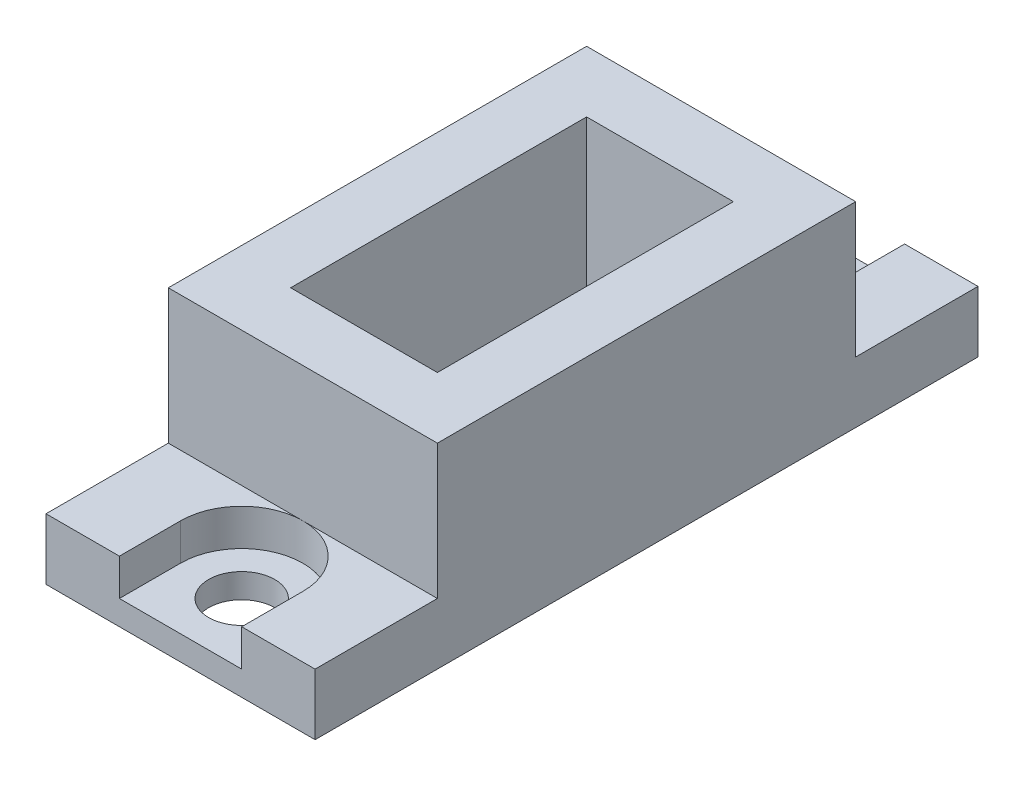
ISO-10303-21;
HEADER;
FILE_DESCRIPTION(('STEP AP214'),'2;1');
FILE_NAME('part.step','',(''),(''),'','','');
FILE_SCHEMA(('AUTOMOTIVE_DESIGN { 1 0 10303 214 1 1 1 1 }'));
ENDSEC;
DATA;
#1=APPLICATION_CONTEXT('core data for automotive mechanical design processes');
#2=APPLICATION_PROTOCOL_DEFINITION('international standard','automotive_design',2000,#1);
#3=PRODUCT_CONTEXT('',#1,'mechanical');
#4=PRODUCT('Part','Part','',(#3));
#5=PRODUCT_RELATED_PRODUCT_CATEGORY('part','',(#4));
#6=PRODUCT_DEFINITION_FORMATION('','',#4);
#7=PRODUCT_DEFINITION_CONTEXT('part definition',#1,'design');
#8=PRODUCT_DEFINITION('design','',#6,#7);
#9=PRODUCT_DEFINITION_SHAPE('','',#8);
#10=(LENGTH_UNIT() NAMED_UNIT(*) SI_UNIT(.MILLI.,.METRE.));
#11=(NAMED_UNIT(*) PLANE_ANGLE_UNIT() SI_UNIT($,.RADIAN.));
#12=(NAMED_UNIT(*) SI_UNIT($,.STERADIAN.) SOLID_ANGLE_UNIT());
#13=UNCERTAINTY_MEASURE_WITH_UNIT(LENGTH_MEASURE(1.E-05),#10,'distance_accuracy_value','');
#14=(GEOMETRIC_REPRESENTATION_CONTEXT(3) GLOBAL_UNCERTAINTY_ASSIGNED_CONTEXT((#13)) GLOBAL_UNIT_ASSIGNED_CONTEXT((#10,
#11,#12)) REPRESENTATION_CONTEXT('',''));
#15=CARTESIAN_POINT('',(0.,0.,0.));
#16=DIRECTION('',(0.,0.,1.));
#17=DIRECTION('',(1.,0.,0.));
#18=AXIS2_PLACEMENT_3D('',#15,#16,#17);
#19=CARTESIAN_POINT('',(0.,5.,0.));
#20=DIRECTION('',(0.,1.,0.));
#21=DIRECTION('',(0.,0.,1.));
#22=AXIS2_PLACEMENT_3D('',#19,#20,#21);
#23=PLANE('',#22);
#24=DIRECTION('',(0.,0.,1.));
#25=VECTOR('',#24,1.);
#26=CARTESIAN_POINT('',(1.,5.,-36.2519189633827));
#27=LINE('',#26,#25);
#28=CARTESIAN_POINT('',(1.,5.,-41.2519189633827));
#29=VERTEX_POINT('',#28);
#30=CARTESIAN_POINT('',(1.,5.,-36.2519189633827));
#31=VERTEX_POINT('',#30);
#32=EDGE_CURVE('E51',#29,#31,#27,.T.);
#33=ORIENTED_EDGE('',*,*,#32,.F.);
#34=DIRECTION('',(-1.,0.,0.));
#35=VECTOR('',#34,1.);
#36=CARTESIAN_POINT('',(17.,5.,-41.2519189633827));
#37=LINE('',#36,#35);
#38=CARTESIAN_POINT('',(-5.,5.,-41.2519189633827));
#39=VERTEX_POINT('',#38);
#40=EDGE_CURVE('E271',#29,#39,#37,.T.);
#41=ORIENTED_EDGE('',*,*,#40,.T.);
#42=DIRECTION('',(0.,0.,1.));
#43=VECTOR('',#42,1.);
#44=CARTESIAN_POINT('',(-5.,5.,-31.2519189633827));
#45=LINE('',#44,#43);
#46=CARTESIAN_POINT('',(-5.,5.,-31.2519189633827));
#47=VERTEX_POINT('',#46);
#48=EDGE_CURVE('E275',#39,#47,#45,.T.);
#49=ORIENTED_EDGE('',*,*,#48,.T.);
#50=DIRECTION('',(1.,0.,0.));
#51=VECTOR('',#50,1.);
#52=CARTESIAN_POINT('',(-5.,5.,-31.2519189633827));
#53=LINE('',#52,#51);
#54=CARTESIAN_POINT('',(6.,5.,-31.2519189633827));
#55=VERTEX_POINT('',#54);
#56=EDGE_CURVE('E265',#47,#55,#53,.T.);
#57=ORIENTED_EDGE('',*,*,#56,.T.);
#58=CARTESIAN_POINT('',(6.,5.,-36.2519189633827));
#59=DIRECTION('',(0.,1.,0.));
#60=DIRECTION('',(0.,0.,1.));
#61=AXIS2_PLACEMENT_3D('',#58,#59,#60);
#62=CIRCLE('',#61,5.);
#63=EDGE_CURVE('E205',#31,#55,#62,.T.);
#64=ORIENTED_EDGE('',*,*,#63,.F.);
#65=EDGE_LOOP('',(#33,#41,#49,#57,#64));
#66=FACE_BOUND('',#65,.T.);
#67=ADVANCED_FACE('F34',(#66),#23,.T.);
#68=CARTESIAN_POINT('',(0.,5.,0.));
#69=DIRECTION('',(0.,-1.,0.));
#70=DIRECTION('',(0.,0.,-1.));
#71=AXIS2_PLACEMENT_3D('',#68,#69,#70);
#72=PLANE('',#71);
#73=CARTESIAN_POINT('',(6.,5.,7.94808103661732));
#74=DIRECTION('',(0.,1.,0.));
#75=DIRECTION('',(0.,0.,-1.));
#76=AXIS2_PLACEMENT_3D('',#73,#74,#75);
#77=CIRCLE('',#76,5.);
#78=CARTESIAN_POINT('',(11.,5.,7.94808103661732));
#79=VERTEX_POINT('',#78);
#80=CARTESIAN_POINT('',(6.,5.,2.94808103661732));
#81=VERTEX_POINT('',#80);
#82=EDGE_CURVE('E221',#79,#81,#77,.T.);
#83=ORIENTED_EDGE('',*,*,#82,.F.);
#84=DIRECTION('',(0.,0.,-1.));
#85=VECTOR('',#84,1.);
#86=CARTESIAN_POINT('',(11.,5.,12.9480810366173));
#87=LINE('',#86,#85);
#88=CARTESIAN_POINT('',(11.,5.,12.9480810366173));
#89=VERTEX_POINT('',#88);
#90=EDGE_CURVE('E232',#89,#79,#87,.T.);
#91=ORIENTED_EDGE('',*,*,#90,.F.);
#92=DIRECTION('',(1.,0.,0.));
#93=VECTOR('',#92,1.);
#94=CARTESIAN_POINT('',(17.,5.,12.9480810366173));
#95=LINE('',#94,#93);
#96=CARTESIAN_POINT('',(17.,5.,12.9480810366173));
#97=VERTEX_POINT('',#96);
#98=EDGE_CURVE('E249',#89,#97,#95,.T.);
#99=ORIENTED_EDGE('',*,*,#98,.T.);
#100=DIRECTION('',(0.,0.,-1.));
#101=VECTOR('',#100,1.);
#102=CARTESIAN_POINT('',(17.,5.,2.94808103661732));
#103=LINE('',#102,#101);
#104=CARTESIAN_POINT('',(17.,5.,2.94808103661732));
#105=VERTEX_POINT('',#104);
#106=EDGE_CURVE('E253',#97,#105,#103,.T.);
#107=ORIENTED_EDGE('',*,*,#106,.T.);
#108=DIRECTION('',(-1.,0.,0.));
#109=VECTOR('',#108,1.);
#110=CARTESIAN_POINT('',(-5.,5.,2.94808103661732));
#111=LINE('',#110,#109);
#112=EDGE_CURVE('E243',#105,#81,#111,.T.);
#113=ORIENTED_EDGE('',*,*,#112,.T.);
#114=EDGE_LOOP('',(#83,#91,#99,#107,#113));
#115=FACE_BOUND('',#114,.T.);
#116=ADVANCED_FACE('F397',(#115),#72,.F.);
#117=CARTESIAN_POINT('',(-5.,16.,2.94808103661732));
#118=DIRECTION('',(0.,0.,-1.));
#119=DIRECTION('',(-1.,0.,0.));
#120=AXIS2_PLACEMENT_3D('',#117,#118,#119);
#121=PLANE('',#120);
#122=ORIENTED_EDGE('',*,*,#112,.F.);
#123=DIRECTION('',(0.,-1.,0.));
#124=VECTOR('',#123,1.);
#125=CARTESIAN_POINT('',(17.,16.,2.94808103661732));
#126=LINE('',#125,#124);
#127=CARTESIAN_POINT('',(17.,16.,2.94808103661732));
#128=VERTEX_POINT('',#127);
#129=EDGE_CURVE('E336',#128,#105,#126,.T.);
#130=ORIENTED_EDGE('',*,*,#129,.F.);
#131=DIRECTION('',(1.,0.,0.));
#132=VECTOR('',#131,1.);
#133=CARTESIAN_POINT('',(-5.,16.,2.94808103661732));
#134=LINE('',#133,#132);
#135=CARTESIAN_POINT('',(-5.,16.,2.94808103661732));
#136=VERTEX_POINT('',#135);
#137=EDGE_CURVE('E321',#136,#128,#134,.T.);
#138=ORIENTED_EDGE('',*,*,#137,.F.);
#139=DIRECTION('',(0.,-1.,0.));
#140=VECTOR('',#139,1.);
#141=CARTESIAN_POINT('',(-5.,16.,2.94808103661732));
#142=LINE('',#141,#140);
#143=CARTESIAN_POINT('',(-5.,5.,2.94808103661732));
#144=VERTEX_POINT('',#143);
#145=EDGE_CURVE('E339',#136,#144,#142,.T.);
#146=ORIENTED_EDGE('',*,*,#145,.T.);
#147=EDGE_CURVE('E247',#81,#144,#111,.T.);
#148=ORIENTED_EDGE('',*,*,#147,.F.);
#149=EDGE_LOOP('',(#122,#130,#138,#146,#148));
#150=FACE_BOUND('',#149,.T.);
#151=ADVANCED_FACE('F405',(#150),#121,.F.);
#152=CARTESIAN_POINT('',(-5.,16.,-31.2519189633827));
#153=DIRECTION('',(0.,0.,1.));
#154=DIRECTION('',(1.,0.,0.));
#155=AXIS2_PLACEMENT_3D('',#152,#153,#154);
#156=PLANE('',#155);
#157=ORIENTED_EDGE('',*,*,#56,.F.);
#158=DIRECTION('',(0.,-1.,0.));
#159=VECTOR('',#158,1.);
#160=CARTESIAN_POINT('',(-5.,16.,-31.2519189633827));
#161=LINE('',#160,#159);
#162=CARTESIAN_POINT('',(-5.,16.,-31.2519189633827));
#163=VERTEX_POINT('',#162);
#164=EDGE_CURVE('E328',#163,#47,#161,.T.);
#165=ORIENTED_EDGE('',*,*,#164,.F.);
#166=DIRECTION('',(-1.,0.,0.));
#167=VECTOR('',#166,1.);
#168=CARTESIAN_POINT('',(-5.,16.,-31.2519189633827));
#169=LINE('',#168,#167);
#170=CARTESIAN_POINT('',(17.,16.,-31.2519189633827));
#171=VERTEX_POINT('',#170);
#172=EDGE_CURVE('E326',#171,#163,#169,.T.);
#173=ORIENTED_EDGE('',*,*,#172,.F.);
#174=DIRECTION('',(0.,-1.,0.));
#175=VECTOR('',#174,1.);
#176=CARTESIAN_POINT('',(17.,16.,-31.2519189633827));
#177=LINE('',#176,#175);
#178=CARTESIAN_POINT('',(17.,5.,-31.2519189633827));
#179=VERTEX_POINT('',#178);
#180=EDGE_CURVE('E333',#171,#179,#177,.T.);
#181=ORIENTED_EDGE('',*,*,#180,.T.);
#182=EDGE_CURVE('E269',#55,#179,#53,.T.);
#183=ORIENTED_EDGE('',*,*,#182,.F.);
#184=EDGE_LOOP('',(#157,#165,#173,#181,#183));
#185=FACE_BOUND('',#184,.T.);
#186=ADVANCED_FACE('F429',(#185),#156,.F.);
#187=CARTESIAN_POINT('',(0.,16.,0.));
#188=DIRECTION('',(0.,1.,0.));
#189=DIRECTION('',(0.,0.,1.));
#190=AXIS2_PLACEMENT_3D('',#187,#188,#189);
#191=PLANE('',#190);
#192=DIRECTION('',(0.,0.,1.));
#193=VECTOR('',#192,1.);
#194=CARTESIAN_POINT('',(-5.,16.,-31.2519189633827));
#195=LINE('',#194,#193);
#196=EDGE_CURVE('E318',#163,#136,#195,.T.);
#197=ORIENTED_EDGE('',*,*,#196,.T.);
#198=ORIENTED_EDGE('',*,*,#137,.T.);
#199=DIRECTION('',(0.,0.,-1.));
#200=VECTOR('',#199,1.);
#201=CARTESIAN_POINT('',(17.,16.,-31.2519189633827));
#202=LINE('',#201,#200);
#203=EDGE_CURVE('E324',#128,#171,#202,.T.);
#204=ORIENTED_EDGE('',*,*,#203,.T.);
#205=ORIENTED_EDGE('',*,*,#172,.T.);
#206=EDGE_LOOP('',(#197,#198,#204,#205));
#207=FACE_BOUND('',#206,.T.);
#208=DIRECTION('',(0.,0.,-1.));
#209=VECTOR('',#208,1.);
#210=CARTESIAN_POINT('',(12.,16.,-26.2519189633827));
#211=LINE('',#210,#209);
#212=CARTESIAN_POINT('',(12.,16.,-2.05191896338268));
#213=VERTEX_POINT('',#212);
#214=CARTESIAN_POINT('',(12.,16.,-26.2519189633827));
#215=VERTEX_POINT('',#214);
#216=EDGE_CURVE('E289',#213,#215,#211,.T.);
#217=ORIENTED_EDGE('',*,*,#216,.F.);
#218=DIRECTION('',(1.,0.,0.));
#219=VECTOR('',#218,1.);
#220=CARTESIAN_POINT('',(12.,16.,-2.05191896338268));
#221=LINE('',#220,#219);
#222=CARTESIAN_POINT('',(0.,16.,-2.05191896338268));
#223=VERTEX_POINT('',#222);
#224=EDGE_CURVE('E287',#223,#213,#221,.T.);
#225=ORIENTED_EDGE('',*,*,#224,.F.);
#226=DIRECTION('',(0.,0.,1.));
#227=VECTOR('',#226,1.);
#228=CARTESIAN_POINT('',(0.,16.,-2.05191896338268));
#229=LINE('',#228,#227);
#230=CARTESIAN_POINT('',(0.,16.,-26.2519189633827));
#231=VERTEX_POINT('',#230);
#232=EDGE_CURVE('E295',#231,#223,#229,.T.);
#233=ORIENTED_EDGE('',*,*,#232,.F.);
#234=DIRECTION('',(-1.,0.,0.));
#235=VECTOR('',#234,1.);
#236=CARTESIAN_POINT('',(0.,16.,-26.2519189633827));
#237=LINE('',#236,#235);
#238=EDGE_CURVE('E292',#215,#231,#237,.T.);
#239=ORIENTED_EDGE('',*,*,#238,.F.);
#240=EDGE_LOOP('',(#217,#225,#233,#239));
#241=FACE_BOUND('',#240,.T.);
#242=ADVANCED_FACE('F363',(#207,#241),#191,.T.);
#243=CARTESIAN_POINT('',(0.,0.,0.));
#244=DIRECTION('',(0.,1.,0.));
#245=DIRECTION('',(0.,0.,1.));
#246=AXIS2_PLACEMENT_3D('',#243,#244,#245);
#247=PLANE('',#246);
#248=CARTESIAN_POINT('',(6.,0.,7.94808103661732));
#249=DIRECTION('',(0.,-1.,0.));
#250=DIRECTION('',(0.,0.,-1.));
#251=AXIS2_PLACEMENT_3D('',#248,#249,#250);
#252=CIRCLE('',#251,2.7);
#253=CARTESIAN_POINT('',(6.,0.,5.24808103661732));
#254=VERTEX_POINT('',#253);
#255=EDGE_CURVE('E345',#254,#254,#252,.T.);
#256=ORIENTED_EDGE('',*,*,#255,.F.);
#257=EDGE_LOOP('',(#256));
#258=FACE_BOUND('',#257,.T.);
#259=CARTESIAN_POINT('',(6.,0.,-36.2519189633827));
#260=DIRECTION('',(0.,-1.,0.));
#261=DIRECTION('',(0.,0.,-1.));
#262=AXIS2_PLACEMENT_3D('',#259,#260,#261);
#263=CIRCLE('',#262,2.7);
#264=CARTESIAN_POINT('',(6.,0.,-38.9519189633827));
#265=VERTEX_POINT('',#264);
#266=EDGE_CURVE('E350',#265,#265,#263,.T.);
#267=ORIENTED_EDGE('',*,*,#266,.F.);
#268=EDGE_LOOP('',(#267));
#269=FACE_BOUND('',#268,.T.);
#270=DIRECTION('',(0.,0.,1.));
#271=VECTOR('',#270,1.);
#272=CARTESIAN_POINT('',(-5.,0.,-31.2519189633827));
#273=LINE('',#272,#271);
#274=CARTESIAN_POINT('',(-5.,0.,-41.2519189633827));
#275=VERTEX_POINT('',#274);
#276=CARTESIAN_POINT('',(-5.,0.,12.9480810366173));
#277=VERTEX_POINT('',#276);
#278=EDGE_CURVE('E317',#275,#277,#273,.T.);
#279=ORIENTED_EDGE('',*,*,#278,.F.);
#280=DIRECTION('',(-1.,0.,0.));
#281=VECTOR('',#280,1.);
#282=CARTESIAN_POINT('',(17.,0.,-41.2519189633827));
#283=LINE('',#282,#281);
#284=CARTESIAN_POINT('',(17.,0.,-41.2519189633827));
#285=VERTEX_POINT('',#284);
#286=EDGE_CURVE('E264',#285,#275,#283,.T.);
#287=ORIENTED_EDGE('',*,*,#286,.F.);
#288=DIRECTION('',(0.,0.,-1.));
#289=VECTOR('',#288,1.);
#290=CARTESIAN_POINT('',(17.,0.,-31.2519189633827));
#291=LINE('',#290,#289);
#292=CARTESIAN_POINT('',(17.,0.,12.9480810366173));
#293=VERTEX_POINT('',#292);
#294=EDGE_CURVE('E322',#293,#285,#291,.T.);
#295=ORIENTED_EDGE('',*,*,#294,.F.);
#296=DIRECTION('',(1.,0.,0.));
#297=VECTOR('',#296,1.);
#298=CARTESIAN_POINT('',(17.,0.,12.9480810366173));
#299=LINE('',#298,#297);
#300=EDGE_CURVE('E213',#277,#293,#299,.T.);
#301=ORIENTED_EDGE('',*,*,#300,.F.);
#302=EDGE_LOOP('',(#279,#287,#295,#301));
#303=FACE_BOUND('',#302,.T.);
#304=DIRECTION('',(1.,0.,0.));
#305=VECTOR('',#304,1.);
#306=CARTESIAN_POINT('',(12.,0.,-2.05191896338268));
#307=LINE('',#306,#305);
#308=CARTESIAN_POINT('',(0.,0.,-2.05191896338268));
#309=VERTEX_POINT('',#308);
#310=CARTESIAN_POINT('',(12.,0.,-2.05191896338268));
#311=VERTEX_POINT('',#310);
#312=EDGE_CURVE('E286',#309,#311,#307,.T.);
#313=ORIENTED_EDGE('',*,*,#312,.T.);
#314=DIRECTION('',(0.,0.,-1.));
#315=VECTOR('',#314,1.);
#316=CARTESIAN_POINT('',(12.,0.,-26.2519189633827));
#317=LINE('',#316,#315);
#318=CARTESIAN_POINT('',(12.,0.,-26.2519189633827));
#319=VERTEX_POINT('',#318);
#320=EDGE_CURVE('E300',#311,#319,#317,.T.);
#321=ORIENTED_EDGE('',*,*,#320,.T.);
#322=DIRECTION('',(-1.,0.,0.));
#323=VECTOR('',#322,1.);
#324=CARTESIAN_POINT('',(0.,0.,-26.2519189633827));
#325=LINE('',#324,#323);
#326=CARTESIAN_POINT('',(0.,0.,-26.2519189633827));
#327=VERTEX_POINT('',#326);
#328=EDGE_CURVE('E303',#319,#327,#325,.T.);
#329=ORIENTED_EDGE('',*,*,#328,.T.);
#330=DIRECTION('',(0.,0.,1.));
#331=VECTOR('',#330,1.);
#332=CARTESIAN_POINT('',(0.,0.,-2.05191896338268));
#333=LINE('',#332,#331);
#334=EDGE_CURVE('E290',#327,#309,#333,.T.);
#335=ORIENTED_EDGE('',*,*,#334,.T.);
#336=EDGE_LOOP('',(#313,#321,#329,#335));
#337=FACE_BOUND('',#336,.T.);
#338=ADVANCED_FACE('F360',(#258,#269,#303,#337),#247,.F.);
#339=CARTESIAN_POINT('',(-5.,16.,-31.2519189633827));
#340=DIRECTION('',(1.,0.,0.));
#341=DIRECTION('',(0.,0.,-1.));
#342=AXIS2_PLACEMENT_3D('',#339,#340,#341);
#343=PLANE('',#342);
#344=ORIENTED_EDGE('',*,*,#278,.T.);
#345=DIRECTION('',(0.,-1.,0.));
#346=VECTOR('',#345,1.);
#347=CARTESIAN_POINT('',(-5.,5.,12.9480810366173));
#348=LINE('',#347,#346);
#349=CARTESIAN_POINT('',(-5.,5.,12.9480810366173));
#350=VERTEX_POINT('',#349);
#351=EDGE_CURVE('E261',#350,#277,#348,.T.);
#352=ORIENTED_EDGE('',*,*,#351,.F.);
#353=DIRECTION('',(0.,0.,1.));
#354=VECTOR('',#353,1.);
#355=CARTESIAN_POINT('',(-5.,5.,2.94808103661732));
#356=LINE('',#355,#354);
#357=EDGE_CURVE('E246',#144,#350,#356,.T.);
#358=ORIENTED_EDGE('',*,*,#357,.F.);
#359=ORIENTED_EDGE('',*,*,#145,.F.);
#360=ORIENTED_EDGE('',*,*,#196,.F.);
#361=ORIENTED_EDGE('',*,*,#164,.T.);
#362=ORIENTED_EDGE('',*,*,#48,.F.);
#363=DIRECTION('',(0.,-1.,0.));
#364=VECTOR('',#363,1.);
#365=CARTESIAN_POINT('',(-5.,5.,-41.2519189633827));
#366=LINE('',#365,#364);
#367=EDGE_CURVE('E278',#39,#275,#366,.T.);
#368=ORIENTED_EDGE('',*,*,#367,.T.);
#369=EDGE_LOOP('',(#344,#352,#358,#359,#360,#361,#362,#368));
#370=FACE_BOUND('',#369,.T.);
#371=ADVANCED_FACE('F36',(#370),#343,.F.);
#372=CARTESIAN_POINT('',(17.,16.,-31.2519189633827));
#373=DIRECTION('',(-1.,0.,0.));
#374=DIRECTION('',(0.,0.,1.));
#375=AXIS2_PLACEMENT_3D('',#372,#373,#374);
#376=PLANE('',#375);
#377=ORIENTED_EDGE('',*,*,#294,.T.);
#378=DIRECTION('',(0.,-1.,0.));
#379=VECTOR('',#378,1.);
#380=CARTESIAN_POINT('',(17.,5.,-41.2519189633827));
#381=LINE('',#380,#379);
#382=CARTESIAN_POINT('',(17.,5.,-41.2519189633827));
#383=VERTEX_POINT('',#382);
#384=EDGE_CURVE('E283',#383,#285,#381,.T.);
#385=ORIENTED_EDGE('',*,*,#384,.F.);
#386=DIRECTION('',(0.,0.,-1.));
#387=VECTOR('',#386,1.);
#388=CARTESIAN_POINT('',(17.,5.,-31.2519189633827));
#389=LINE('',#388,#387);
#390=EDGE_CURVE('E268',#179,#383,#389,.T.);
#391=ORIENTED_EDGE('',*,*,#390,.F.);
#392=ORIENTED_EDGE('',*,*,#180,.F.);
#393=ORIENTED_EDGE('',*,*,#203,.F.);
#394=ORIENTED_EDGE('',*,*,#129,.T.);
#395=ORIENTED_EDGE('',*,*,#106,.F.);
#396=DIRECTION('',(0.,-1.,0.));
#397=VECTOR('',#396,1.);
#398=CARTESIAN_POINT('',(17.,5.,12.9480810366173));
#399=LINE('',#398,#397);
#400=EDGE_CURVE('E256',#97,#293,#399,.T.);
#401=ORIENTED_EDGE('',*,*,#400,.T.);
#402=EDGE_LOOP('',(#377,#385,#391,#392,#393,#394,#395,#401));
#403=FACE_BOUND('',#402,.T.);
#404=ADVANCED_FACE('F442',(#403),#376,.F.);
#405=CARTESIAN_POINT('',(12.,16.,-2.05191896338268));
#406=DIRECTION('',(0.,0.,-1.));
#407=DIRECTION('',(-1.,0.,0.));
#408=AXIS2_PLACEMENT_3D('',#405,#406,#407);
#409=PLANE('',#408);
#410=ORIENTED_EDGE('',*,*,#312,.F.);
#411=DIRECTION('',(0.,-1.,0.));
#412=VECTOR('',#411,1.);
#413=CARTESIAN_POINT('',(0.,16.,-2.05191896338268));
#414=LINE('',#413,#412);
#415=EDGE_CURVE('E297',#223,#309,#414,.T.);
#416=ORIENTED_EDGE('',*,*,#415,.F.);
#417=ORIENTED_EDGE('',*,*,#224,.T.);
#418=DIRECTION('',(0.,-1.,0.));
#419=VECTOR('',#418,1.);
#420=CARTESIAN_POINT('',(12.,16.,-2.05191896338268));
#421=LINE('',#420,#419);
#422=EDGE_CURVE('E314',#213,#311,#421,.T.);
#423=ORIENTED_EDGE('',*,*,#422,.T.);
#424=EDGE_LOOP('',(#410,#416,#417,#423));
#425=FACE_BOUND('',#424,.T.);
#426=ADVANCED_FACE('F372',(#425),#409,.T.);
#427=CARTESIAN_POINT('',(12.,16.,-26.2519189633827));
#428=DIRECTION('',(-1.,0.,0.));
#429=DIRECTION('',(0.,0.,1.));
#430=AXIS2_PLACEMENT_3D('',#427,#428,#429);
#431=PLANE('',#430);
#432=ORIENTED_EDGE('',*,*,#320,.F.);
#433=ORIENTED_EDGE('',*,*,#422,.F.);
#434=ORIENTED_EDGE('',*,*,#216,.T.);
#435=DIRECTION('',(0.,-1.,0.));
#436=VECTOR('',#435,1.);
#437=CARTESIAN_POINT('',(12.,16.,-26.2519189633827));
#438=LINE('',#437,#436);
#439=EDGE_CURVE('E312',#215,#319,#438,.T.);
#440=ORIENTED_EDGE('',*,*,#439,.T.);
#441=EDGE_LOOP('',(#432,#433,#434,#440));
#442=FACE_BOUND('',#441,.T.);
#443=ADVANCED_FACE('F382',(#442),#431,.T.);
#444=CARTESIAN_POINT('',(0.,16.,-26.2519189633827));
#445=DIRECTION('',(0.,0.,1.));
#446=DIRECTION('',(1.,0.,0.));
#447=AXIS2_PLACEMENT_3D('',#444,#445,#446);
#448=PLANE('',#447);
#449=ORIENTED_EDGE('',*,*,#328,.F.);
#450=ORIENTED_EDGE('',*,*,#439,.F.);
#451=ORIENTED_EDGE('',*,*,#238,.T.);
#452=DIRECTION('',(0.,-1.,0.));
#453=VECTOR('',#452,1.);
#454=CARTESIAN_POINT('',(0.,16.,-26.2519189633827));
#455=LINE('',#454,#453);
#456=EDGE_CURVE('E310',#231,#327,#455,.T.);
#457=ORIENTED_EDGE('',*,*,#456,.T.);
#458=EDGE_LOOP('',(#449,#450,#451,#457));
#459=FACE_BOUND('',#458,.T.);
#460=ADVANCED_FACE('F386',(#459),#448,.T.);
#461=CARTESIAN_POINT('',(0.,16.,-2.05191896338268));
#462=DIRECTION('',(1.,0.,0.));
#463=DIRECTION('',(0.,0.,-1.));
#464=AXIS2_PLACEMENT_3D('',#461,#462,#463);
#465=PLANE('',#464);
#466=ORIENTED_EDGE('',*,*,#334,.F.);
#467=ORIENTED_EDGE('',*,*,#456,.F.);
#468=ORIENTED_EDGE('',*,*,#232,.T.);
#469=ORIENTED_EDGE('',*,*,#415,.T.);
#470=EDGE_LOOP('',(#466,#467,#468,#469));
#471=FACE_BOUND('',#470,.T.);
#472=ADVANCED_FACE('F376',(#471),#465,.T.);
#473=CARTESIAN_POINT('',(17.,5.,-41.2519189633827));
#474=DIRECTION('',(0.,0.,1.));
#475=DIRECTION('',(1.,0.,0.));
#476=AXIS2_PLACEMENT_3D('',#473,#474,#475);
#477=PLANE('',#476);
#478=ORIENTED_EDGE('',*,*,#40,.F.);
#479=DIRECTION('',(0.,1.,0.));
#480=VECTOR('',#479,1.);
#481=CARTESIAN_POINT('',(1.,2.,-41.2519189633827));
#482=LINE('',#481,#480);
#483=CARTESIAN_POINT('',(1.,2.,-41.2519189633827));
#484=VERTEX_POINT('',#483);
#485=EDGE_CURVE('E214',#484,#29,#482,.T.);
#486=ORIENTED_EDGE('',*,*,#485,.F.);
#487=DIRECTION('',(-1.,0.,0.));
#488=VECTOR('',#487,1.);
#489=CARTESIAN_POINT('',(1.,2.,-41.2519189633827));
#490=LINE('',#489,#488);
#491=CARTESIAN_POINT('',(11.,2.,-41.2519189633827));
#492=VERTEX_POINT('',#491);
#493=EDGE_CURVE('E199',#492,#484,#490,.T.);
#494=ORIENTED_EDGE('',*,*,#493,.F.);
#495=DIRECTION('',(0.,1.,0.));
#496=VECTOR('',#495,1.);
#497=CARTESIAN_POINT('',(11.,2.,-41.2519189633827));
#498=LINE('',#497,#496);
#499=CARTESIAN_POINT('',(11.,5.,-41.2519189633827));
#500=VERTEX_POINT('',#499);
#501=EDGE_CURVE('E195',#492,#500,#498,.T.);
#502=ORIENTED_EDGE('',*,*,#501,.T.);
#503=EDGE_CURVE('E272',#383,#500,#37,.T.);
#504=ORIENTED_EDGE('',*,*,#503,.F.);
#505=ORIENTED_EDGE('',*,*,#384,.T.);
#506=ORIENTED_EDGE('',*,*,#286,.T.);
#507=ORIENTED_EDGE('',*,*,#367,.F.);
#508=EDGE_LOOP('',(#478,#486,#494,#502,#504,#505,#506,#507));
#509=FACE_BOUND('',#508,.T.);
#510=ADVANCED_FACE('F393',(#509),#477,.F.);
#511=DIRECTION('',(0.,0.,-1.));
#512=VECTOR('',#511,1.);
#513=CARTESIAN_POINT('',(11.,5.,-41.2519189633827));
#514=LINE('',#513,#512);
#515=CARTESIAN_POINT('',(11.,5.,-36.2519189633827));
#516=VERTEX_POINT('',#515);
#517=EDGE_CURVE('E207',#516,#500,#514,.T.);
#518=ORIENTED_EDGE('',*,*,#517,.F.);
#519=CARTESIAN_POINT('',(6.,5.,-36.2519189633827));
#520=DIRECTION('',(0.,1.,0.));
#521=DIRECTION('',(0.,0.,1.));
#522=AXIS2_PLACEMENT_3D('',#519,#520,#521);
#523=CIRCLE('',#522,5.);
#524=EDGE_CURVE('E11',#55,#516,#523,.T.);
#525=ORIENTED_EDGE('',*,*,#524,.F.);
#526=ORIENTED_EDGE('',*,*,#182,.T.);
#527=ORIENTED_EDGE('',*,*,#390,.T.);
#528=ORIENTED_EDGE('',*,*,#503,.T.);
#529=EDGE_LOOP('',(#518,#525,#526,#527,#528));
#530=FACE_BOUND('',#529,.T.);
#531=ADVANCED_FACE('F400',(#530),#23,.T.);
#532=CARTESIAN_POINT('',(17.,5.,12.9480810366173));
#533=DIRECTION('',(0.,0.,-1.));
#534=DIRECTION('',(-1.,0.,0.));
#535=AXIS2_PLACEMENT_3D('',#532,#533,#534);
#536=PLANE('',#535);
#537=ORIENTED_EDGE('',*,*,#98,.F.);
#538=DIRECTION('',(0.,1.,0.));
#539=VECTOR('',#538,1.);
#540=CARTESIAN_POINT('',(11.,2.,12.9480810366173));
#541=LINE('',#540,#539);
#542=CARTESIAN_POINT('',(11.,2.,12.9480810366173));
#543=VERTEX_POINT('',#542);
#544=EDGE_CURVE('E237',#543,#89,#541,.T.);
#545=ORIENTED_EDGE('',*,*,#544,.F.);
#546=DIRECTION('',(1.,0.,0.));
#547=VECTOR('',#546,1.);
#548=CARTESIAN_POINT('',(1.,2.,12.9480810366173));
#549=LINE('',#548,#547);
#550=CARTESIAN_POINT('',(1.,2.,12.9480810366173));
#551=VERTEX_POINT('',#550);
#552=EDGE_CURVE('E224',#551,#543,#549,.T.);
#553=ORIENTED_EDGE('',*,*,#552,.F.);
#554=DIRECTION('',(0.,1.,0.));
#555=VECTOR('',#554,1.);
#556=CARTESIAN_POINT('',(1.,2.,12.9480810366173));
#557=LINE('',#556,#555);
#558=CARTESIAN_POINT('',(1.,5.,12.9480810366173));
#559=VERTEX_POINT('',#558);
#560=EDGE_CURVE('E239',#551,#559,#557,.T.);
#561=ORIENTED_EDGE('',*,*,#560,.T.);
#562=EDGE_CURVE('E250',#350,#559,#95,.T.);
#563=ORIENTED_EDGE('',*,*,#562,.F.);
#564=ORIENTED_EDGE('',*,*,#351,.T.);
#565=ORIENTED_EDGE('',*,*,#300,.T.);
#566=ORIENTED_EDGE('',*,*,#400,.F.);
#567=EDGE_LOOP('',(#537,#545,#553,#561,#563,#564,#565,#566));
#568=FACE_BOUND('',#567,.T.);
#569=ADVANCED_FACE('F412',(#568),#536,.F.);
#570=DIRECTION('',(0.,0.,1.));
#571=VECTOR('',#570,1.);
#572=CARTESIAN_POINT('',(1.,5.,7.94808103661732));
#573=LINE('',#572,#571);
#574=CARTESIAN_POINT('',(1.,5.,7.94808103661732));
#575=VERTEX_POINT('',#574);
#576=EDGE_CURVE('E230',#575,#559,#573,.T.);
#577=ORIENTED_EDGE('',*,*,#576,.F.);
#578=CARTESIAN_POINT('',(6.,5.,7.94808103661732));
#579=DIRECTION('',(0.,-1.,0.));
#580=DIRECTION('',(0.,0.,-1.));
#581=AXIS2_PLACEMENT_3D('',#578,#579,#580);
#582=CIRCLE('',#581,5.);
#583=EDGE_CURVE('E43',#575,#81,#582,.T.);
#584=ORIENTED_EDGE('',*,*,#583,.T.);
#585=ORIENTED_EDGE('',*,*,#147,.T.);
#586=ORIENTED_EDGE('',*,*,#357,.T.);
#587=ORIENTED_EDGE('',*,*,#562,.T.);
#588=EDGE_LOOP('',(#577,#584,#585,#586,#587));
#589=FACE_BOUND('',#588,.T.);
#590=ADVANCED_FACE('F408',(#589),#72,.F.);
#591=CARTESIAN_POINT('',(6.,2.,7.94808103661732));
#592=DIRECTION('',(0.,1.,0.));
#593=DIRECTION('',(0.,0.,1.));
#594=AXIS2_PLACEMENT_3D('',#591,#592,#593);
#595=CYLINDRICAL_SURFACE('',#594,5.);
#596=ORIENTED_EDGE('',*,*,#82,.T.);
#597=ORIENTED_EDGE('',*,*,#583,.F.);
#598=DIRECTION('',(0.,1.,0.));
#599=VECTOR('',#598,1.);
#600=CARTESIAN_POINT('',(1.,2.,7.94808103661732));
#601=LINE('',#600,#599);
#602=CARTESIAN_POINT('',(1.,2.,7.94808103661732));
#603=VERTEX_POINT('',#602);
#604=EDGE_CURVE('E59',#603,#575,#601,.T.);
#605=ORIENTED_EDGE('',*,*,#604,.F.);
#606=CARTESIAN_POINT('',(6.,2.,7.94808103661732));
#607=DIRECTION('',(0.,1.,0.));
#608=DIRECTION('',(0.,0.,1.));
#609=AXIS2_PLACEMENT_3D('',#606,#607,#608);
#610=CIRCLE('',#609,5.);
#611=CARTESIAN_POINT('',(11.,2.,7.94808103661732));
#612=VERTEX_POINT('',#611);
#613=EDGE_CURVE('E217',#612,#603,#610,.T.);
#614=ORIENTED_EDGE('',*,*,#613,.F.);
#615=DIRECTION('',(0.,1.,0.));
#616=VECTOR('',#615,1.);
#617=CARTESIAN_POINT('',(11.,2.,7.94808103661732));
#618=LINE('',#617,#616);
#619=EDGE_CURVE('E208',#612,#79,#618,.T.);
#620=ORIENTED_EDGE('',*,*,#619,.T.);
#621=EDGE_LOOP('',(#596,#597,#605,#614,#620));
#622=FACE_BOUND('',#621,.T.);
#623=ADVANCED_FACE('F582',(#622),#595,.F.);
#624=CARTESIAN_POINT('',(11.,2.,12.9480810366173));
#625=DIRECTION('',(1.,0.,0.));
#626=DIRECTION('',(0.,0.,-1.));
#627=AXIS2_PLACEMENT_3D('',#624,#625,#626);
#628=PLANE('',#627);
#629=ORIENTED_EDGE('',*,*,#90,.T.);
#630=ORIENTED_EDGE('',*,*,#619,.F.);
#631=DIRECTION('',(0.,0.,-1.));
#632=VECTOR('',#631,1.);
#633=CARTESIAN_POINT('',(11.,2.,12.9480810366173));
#634=LINE('',#633,#632);
#635=EDGE_CURVE('E227',#543,#612,#634,.T.);
#636=ORIENTED_EDGE('',*,*,#635,.F.);
#637=ORIENTED_EDGE('',*,*,#544,.T.);
#638=EDGE_LOOP('',(#629,#630,#636,#637));
#639=FACE_BOUND('',#638,.T.);
#640=ADVANCED_FACE('F454',(#639),#628,.F.);
#641=CARTESIAN_POINT('',(1.,2.,7.94808103661732));
#642=DIRECTION('',(-1.,0.,0.));
#643=DIRECTION('',(0.,0.,1.));
#644=AXIS2_PLACEMENT_3D('',#641,#642,#643);
#645=PLANE('',#644);
#646=ORIENTED_EDGE('',*,*,#576,.T.);
#647=ORIENTED_EDGE('',*,*,#560,.F.);
#648=DIRECTION('',(0.,0.,1.));
#649=VECTOR('',#648,1.);
#650=CARTESIAN_POINT('',(1.,2.,7.94808103661732));
#651=LINE('',#650,#649);
#652=EDGE_CURVE('E220',#603,#551,#651,.T.);
#653=ORIENTED_EDGE('',*,*,#652,.F.);
#654=ORIENTED_EDGE('',*,*,#604,.T.);
#655=EDGE_LOOP('',(#646,#647,#653,#654));
#656=FACE_BOUND('',#655,.T.);
#657=ADVANCED_FACE('F458',(#656),#645,.F.);
#658=CARTESIAN_POINT('',(6.,2.,7.94808103661732));
#659=DIRECTION('',(0.,1.,0.));
#660=DIRECTION('',(0.,0.,1.));
#661=AXIS2_PLACEMENT_3D('',#658,#659,#660);
#662=PLANE('',#661);
#663=CARTESIAN_POINT('',(6.,2.,7.94808103661732));
#664=DIRECTION('',(0.,1.,0.));
#665=DIRECTION('',(0.,0.,1.));
#666=AXIS2_PLACEMENT_3D('',#663,#664,#665);
#667=CIRCLE('',#666,2.7);
#668=CARTESIAN_POINT('',(6.,2.,10.6480810366173));
#669=VERTEX_POINT('',#668);
#670=EDGE_CURVE('E38',#669,#669,#667,.T.);
#671=ORIENTED_EDGE('',*,*,#670,.F.);
#672=EDGE_LOOP('',(#671));
#673=FACE_BOUND('',#672,.T.);
#674=ORIENTED_EDGE('',*,*,#613,.T.);
#675=ORIENTED_EDGE('',*,*,#652,.T.);
#676=ORIENTED_EDGE('',*,*,#552,.T.);
#677=ORIENTED_EDGE('',*,*,#635,.T.);
#678=EDGE_LOOP('',(#674,#675,#676,#677));
#679=FACE_BOUND('',#678,.T.);
#680=ADVANCED_FACE('F457',(#673,#679),#662,.T.);
#681=CARTESIAN_POINT('',(1.,2.,-36.2519189633827));
#682=DIRECTION('',(-1.,0.,0.));
#683=DIRECTION('',(0.,0.,1.));
#684=AXIS2_PLACEMENT_3D('',#681,#682,#683);
#685=PLANE('',#684);
#686=ORIENTED_EDGE('',*,*,#32,.T.);
#687=DIRECTION('',(0.,1.,0.));
#688=VECTOR('',#687,1.);
#689=CARTESIAN_POINT('',(1.,2.,-36.2519189633827));
#690=LINE('',#689,#688);
#691=CARTESIAN_POINT('',(1.,2.,-36.2519189633827));
#692=VERTEX_POINT('',#691);
#693=EDGE_CURVE('E211',#692,#31,#690,.T.);
#694=ORIENTED_EDGE('',*,*,#693,.F.);
#695=DIRECTION('',(0.,0.,1.));
#696=VECTOR('',#695,1.);
#697=CARTESIAN_POINT('',(1.,2.,-36.2519189633827));
#698=LINE('',#697,#696);
#699=EDGE_CURVE('E186',#484,#692,#698,.T.);
#700=ORIENTED_EDGE('',*,*,#699,.F.);
#701=ORIENTED_EDGE('',*,*,#485,.T.);
#702=EDGE_LOOP('',(#686,#694,#700,#701));
#703=FACE_BOUND('',#702,.T.);
#704=ADVANCED_FACE('F424',(#703),#685,.F.);
#705=CARTESIAN_POINT('',(11.,2.,-41.2519189633827));
#706=DIRECTION('',(1.,0.,0.));
#707=DIRECTION('',(0.,0.,-1.));
#708=AXIS2_PLACEMENT_3D('',#705,#706,#707);
#709=PLANE('',#708);
#710=ORIENTED_EDGE('',*,*,#517,.T.);
#711=ORIENTED_EDGE('',*,*,#501,.F.);
#712=DIRECTION('',(0.,0.,-1.));
#713=VECTOR('',#712,1.);
#714=CARTESIAN_POINT('',(11.,2.,-41.2519189633827));
#715=LINE('',#714,#713);
#716=CARTESIAN_POINT('',(11.,2.,-36.2519189633827));
#717=VERTEX_POINT('',#716);
#718=EDGE_CURVE('E183',#717,#492,#715,.T.);
#719=ORIENTED_EDGE('',*,*,#718,.F.);
#720=DIRECTION('',(0.,1.,0.));
#721=VECTOR('',#720,1.);
#722=CARTESIAN_POINT('',(11.,2.,-36.2519189633827));
#723=LINE('',#722,#721);
#724=EDGE_CURVE('E190',#717,#516,#723,.T.);
#725=ORIENTED_EDGE('',*,*,#724,.T.);
#726=EDGE_LOOP('',(#710,#711,#719,#725));
#727=FACE_BOUND('',#726,.T.);
#728=ADVANCED_FACE('F197',(#727),#709,.F.);
#729=CARTESIAN_POINT('',(6.,2.,-36.2519189633827));
#730=DIRECTION('',(0.,1.,0.));
#731=DIRECTION('',(0.,0.,1.));
#732=AXIS2_PLACEMENT_3D('',#729,#730,#731);
#733=CYLINDRICAL_SURFACE('',#732,5.);
#734=ORIENTED_EDGE('',*,*,#63,.T.);
#735=ORIENTED_EDGE('',*,*,#524,.T.);
#736=ORIENTED_EDGE('',*,*,#724,.F.);
#737=CARTESIAN_POINT('',(6.,2.,-36.2519189633827));
#738=DIRECTION('',(0.,1.,0.));
#739=DIRECTION('',(0.,0.,-1.));
#740=AXIS2_PLACEMENT_3D('',#737,#738,#739);
#741=CIRCLE('',#740,5.);
#742=EDGE_CURVE('E179',#692,#717,#741,.T.);
#743=ORIENTED_EDGE('',*,*,#742,.F.);
#744=ORIENTED_EDGE('',*,*,#693,.T.);
#745=EDGE_LOOP('',(#734,#735,#736,#743,#744));
#746=FACE_BOUND('',#745,.T.);
#747=ADVANCED_FACE('F191',(#746),#733,.F.);
#748=CARTESIAN_POINT('',(6.,2.,-36.2519189633827));
#749=DIRECTION('',(0.,-1.,0.));
#750=DIRECTION('',(0.,0.,-1.));
#751=AXIS2_PLACEMENT_3D('',#748,#749,#750);
#752=PLANE('',#751);
#753=CARTESIAN_POINT('',(6.,2.,-36.2519189633827));
#754=DIRECTION('',(0.,-1.,0.));
#755=DIRECTION('',(0.,0.,-1.));
#756=AXIS2_PLACEMENT_3D('',#753,#754,#755);
#757=CIRCLE('',#756,2.7);
#758=CARTESIAN_POINT('',(6.,2.,-38.9519189633827));
#759=VERTEX_POINT('',#758);
#760=EDGE_CURVE('E343',#759,#759,#757,.T.);
#761=ORIENTED_EDGE('',*,*,#760,.T.);
#762=EDGE_LOOP('',(#761));
#763=FACE_BOUND('',#762,.T.);
#764=ORIENTED_EDGE('',*,*,#742,.T.);
#765=ORIENTED_EDGE('',*,*,#718,.T.);
#766=ORIENTED_EDGE('',*,*,#493,.T.);
#767=ORIENTED_EDGE('',*,*,#699,.T.);
#768=EDGE_LOOP('',(#764,#765,#766,#767));
#769=FACE_BOUND('',#768,.T.);
#770=ADVANCED_FACE('F181',(#763,#769),#752,.F.);
#771=CARTESIAN_POINT('',(6.,3.,-36.2519189633827));
#772=DIRECTION('',(0.,-1.,0.));
#773=DIRECTION('',(0.,0.,-1.));
#774=AXIS2_PLACEMENT_3D('',#771,#772,#773);
#775=CYLINDRICAL_SURFACE('',#774,2.7);
#776=ORIENTED_EDGE('',*,*,#266,.T.);
#777=EDGE_LOOP('',(#776));
#778=FACE_BOUND('',#777,.T.);
#779=ORIENTED_EDGE('',*,*,#760,.F.);
#780=EDGE_LOOP('',(#779));
#781=FACE_BOUND('',#780,.T.);
#782=ADVANCED_FACE('F357',(#778,#781),#775,.F.);
#783=CARTESIAN_POINT('',(6.,3.,7.94808103661732));
#784=DIRECTION('',(0.,-1.,0.));
#785=DIRECTION('',(0.,0.,-1.));
#786=AXIS2_PLACEMENT_3D('',#783,#784,#785);
#787=CYLINDRICAL_SURFACE('',#786,2.7);
#788=ORIENTED_EDGE('',*,*,#670,.T.);
#789=EDGE_LOOP('',(#788));
#790=FACE_BOUND('',#789,.T.);
#791=ORIENTED_EDGE('',*,*,#255,.T.);
#792=EDGE_LOOP('',(#791));
#793=FACE_BOUND('',#792,.T.);
#794=ADVANCED_FACE('F564',(#790,#793),#787,.F.);
#795=CLOSED_SHELL('',(#67,#116,#151,#186,#242,#338,#371,#404,#426,#443,#460,#472,#510,#531,#569,
#590,#623,#640,#657,#680,#704,#728,#747,#770,#782,#794));
#796=MANIFOLD_SOLID_BREP('B2',#795);
#797=ADVANCED_BREP_SHAPE_REPRESENTATION('',(#18,#796),#14);
#798=SHAPE_DEFINITION_REPRESENTATION(#9,#797);
ENDSEC;
END-ISO-10303-21;
